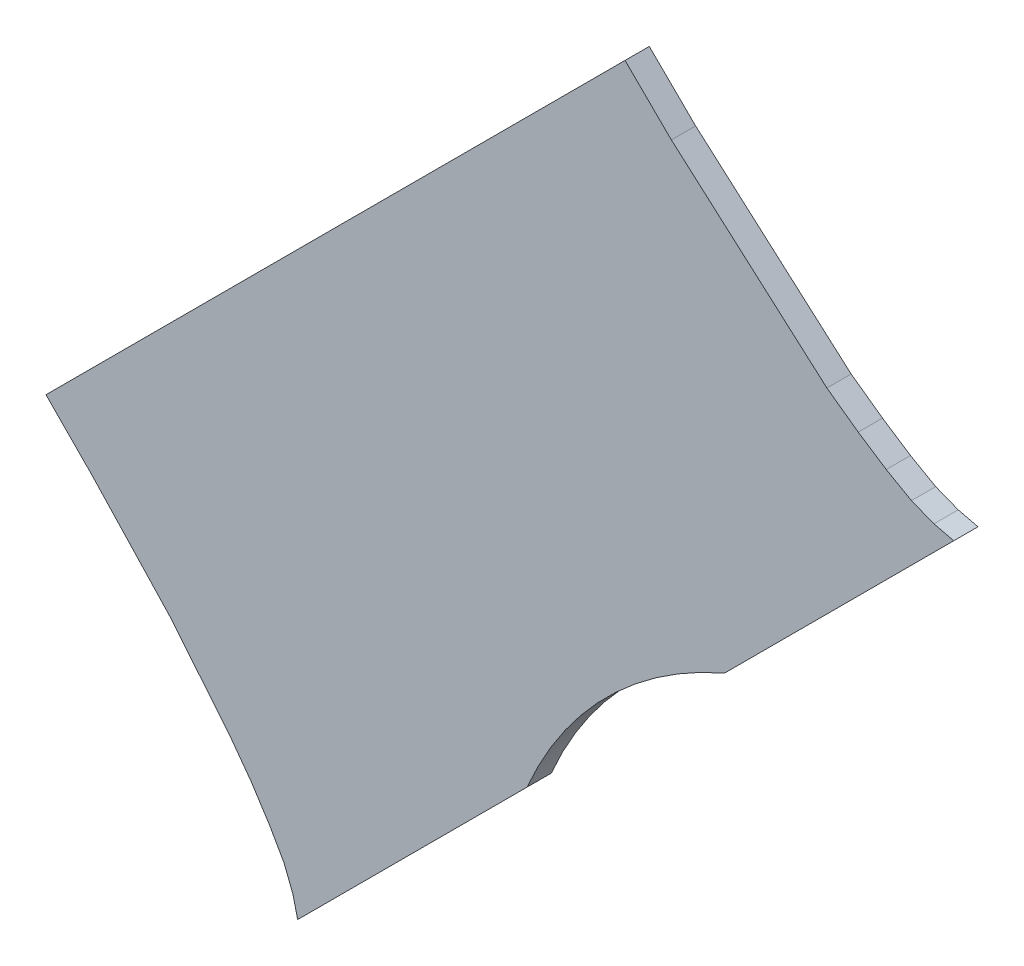
ISO-10303-21;
HEADER;
FILE_DESCRIPTION(('STEP AP214'),'2;1');
FILE_NAME('part.step','',(''),(''),'','','');
FILE_SCHEMA(('AUTOMOTIVE_DESIGN { 1 0 10303 214 1 1 1 1 }'));
ENDSEC;
DATA;
#1=APPLICATION_CONTEXT('core data for automotive mechanical design processes');
#2=APPLICATION_PROTOCOL_DEFINITION('international standard','automotive_design',2000,#1);
#3=PRODUCT_CONTEXT('',#1,'mechanical');
#4=PRODUCT('Part','Part','',(#3));
#5=PRODUCT_RELATED_PRODUCT_CATEGORY('part','',(#4));
#6=PRODUCT_DEFINITION_FORMATION('','',#4);
#7=PRODUCT_DEFINITION_CONTEXT('part definition',#1,'design');
#8=PRODUCT_DEFINITION('design','',#6,#7);
#9=PRODUCT_DEFINITION_SHAPE('','',#8);
#10=(LENGTH_UNIT() NAMED_UNIT(*) SI_UNIT(.MILLI.,.METRE.));
#11=(NAMED_UNIT(*) PLANE_ANGLE_UNIT() SI_UNIT($,.RADIAN.));
#12=(NAMED_UNIT(*) SI_UNIT($,.STERADIAN.) SOLID_ANGLE_UNIT());
#13=UNCERTAINTY_MEASURE_WITH_UNIT(LENGTH_MEASURE(1.E-05),#10,'distance_accuracy_value','');
#14=(GEOMETRIC_REPRESENTATION_CONTEXT(3) GLOBAL_UNCERTAINTY_ASSIGNED_CONTEXT((#13)) GLOBAL_UNIT_ASSIGNED_CONTEXT((#10,
#11,#12)) REPRESENTATION_CONTEXT('',''));
#15=CARTESIAN_POINT('',(0.,0.,0.));
#16=DIRECTION('',(0.,0.,1.));
#17=DIRECTION('',(1.,0.,0.));
#18=AXIS2_PLACEMENT_3D('',#15,#16,#17);
#19=CARTESIAN_POINT('',(78.5380020141602,71.7910003662109,0.));
#20=DIRECTION('',(0.707106781186548,-0.707106781186548,0.));
#21=DIRECTION('',(-0.707106781186548,-0.707106781186548,0.));
#22=AXIS2_PLACEMENT_3D('',#19,#20,#21);
#23=PLANE('',#22);
#24=DIRECTION('',(-0.707106781186548,-0.707106781186548,0.));
#25=VECTOR('',#24,1.);
#26=CARTESIAN_POINT('',(78.5380020141602,71.7910003662109,0.03556));
#27=LINE('',#26,#25);
#28=CARTESIAN_POINT('',(78.5380020141602,71.7910003662109,0.03556));
#29=VERTEX_POINT('',#28);
#30=CARTESIAN_POINT('',(77.6890029907227,70.9420013427734,0.03556));
#31=VERTEX_POINT('',#30);
#32=EDGE_CURVE('E11',#29,#31,#27,.T.);
#33=ORIENTED_EDGE('',*,*,#32,.F.);
#34=DIRECTION('',(0.,0.,1.));
#35=VECTOR('',#34,1.);
#36=CARTESIAN_POINT('',(78.5380020141602,71.7910003662109,0.));
#37=LINE('',#36,#35);
#38=CARTESIAN_POINT('',(78.5380020141602,71.7910003662109,0.));
#39=VERTEX_POINT('',#38);
#40=EDGE_CURVE('E24',#39,#29,#37,.T.);
#41=ORIENTED_EDGE('',*,*,#40,.F.);
#42=DIRECTION('',(-0.707106781186548,-0.707106781186548,0.));
#43=VECTOR('',#42,1.);
#44=CARTESIAN_POINT('',(78.5380020141602,71.7910003662109,0.));
#45=LINE('',#44,#43);
#46=CARTESIAN_POINT('',(77.6890029907227,70.9420013427734,0.));
#47=VERTEX_POINT('',#46);
#48=EDGE_CURVE('E297',#39,#47,#45,.T.);
#49=ORIENTED_EDGE('',*,*,#48,.T.);
#50=DIRECTION('',(0.,0.,1.));
#51=VECTOR('',#50,1.);
#52=CARTESIAN_POINT('',(77.6890029907227,70.9420013427734,0.));
#53=LINE('',#52,#51);
#54=EDGE_CURVE('E37',#47,#31,#53,.T.);
#55=ORIENTED_EDGE('',*,*,#54,.T.);
#56=EDGE_LOOP('',(#33,#41,#49,#55));
#57=FACE_BOUND('',#56,.T.);
#58=ADVANCED_FACE('F17',(#57),#23,.F.);
#59=CARTESIAN_POINT('',(78.6060028076172,71.7239990234375,0.));
#60=DIRECTION('',(-0.701852680042072,-0.712322129038373,0.));
#61=DIRECTION('',(-0.712322129038373,0.701852680042072,0.));
#62=AXIS2_PLACEMENT_3D('',#59,#60,#61);
#63=PLANE('',#62);
#64=DIRECTION('',(-0.712322129038373,0.701852680042072,0.));
#65=VECTOR('',#64,1.);
#66=CARTESIAN_POINT('',(78.6060028076172,71.7239990234375,0.03556));
#67=LINE('',#66,#65);
#68=CARTESIAN_POINT('',(78.6060028076172,71.7239990234375,0.03556));
#69=VERTEX_POINT('',#68);
#70=EDGE_CURVE('E293',#69,#29,#67,.T.);
#71=ORIENTED_EDGE('',*,*,#70,.F.);
#72=DIRECTION('',(0.,0.,1.));
#73=VECTOR('',#72,1.);
#74=CARTESIAN_POINT('',(78.6060028076172,71.7239990234375,0.));
#75=LINE('',#74,#73);
#76=CARTESIAN_POINT('',(78.6060028076172,71.7239990234375,0.));
#77=VERTEX_POINT('',#76);
#78=EDGE_CURVE('E291',#77,#69,#75,.T.);
#79=ORIENTED_EDGE('',*,*,#78,.F.);
#80=DIRECTION('',(-0.712322129038373,0.701852680042072,0.));
#81=VECTOR('',#80,1.);
#82=CARTESIAN_POINT('',(78.6060028076172,71.7239990234375,0.));
#83=LINE('',#82,#81);
#84=EDGE_CURVE('E289',#77,#39,#83,.T.);
#85=ORIENTED_EDGE('',*,*,#84,.T.);
#86=ORIENTED_EDGE('',*,*,#40,.T.);
#87=EDGE_LOOP('',(#71,#79,#85,#86));
#88=FACE_BOUND('',#87,.T.);
#89=ADVANCED_FACE('F300',(#88),#63,.F.);
#90=CARTESIAN_POINT('',(78.8339996337891,71.5230026245117,0.));
#91=DIRECTION('',(-0.661293645405142,-0.750127132256112,0.));
#92=DIRECTION('',(-0.750127132256112,0.661293645405142,0.));
#93=AXIS2_PLACEMENT_3D('',#90,#91,#92);
#94=PLANE('',#93);
#95=DIRECTION('',(-0.750127132256112,0.661293645405142,0.));
#96=VECTOR('',#95,1.);
#97=CARTESIAN_POINT('',(78.8339996337891,71.5230026245117,0.03556));
#98=LINE('',#97,#96);
#99=CARTESIAN_POINT('',(78.8339996337891,71.5230026245117,0.03556));
#100=VERTEX_POINT('',#99);
#101=EDGE_CURVE('E286',#100,#69,#98,.T.);
#102=ORIENTED_EDGE('',*,*,#101,.F.);
#103=DIRECTION('',(0.,0.,1.));
#104=VECTOR('',#103,1.);
#105=CARTESIAN_POINT('',(78.8339996337891,71.5230026245117,0.));
#106=LINE('',#105,#104);
#107=CARTESIAN_POINT('',(78.8339996337891,71.5230026245117,0.));
#108=VERTEX_POINT('',#107);
#109=EDGE_CURVE('E284',#108,#100,#106,.T.);
#110=ORIENTED_EDGE('',*,*,#109,.F.);
#111=DIRECTION('',(-0.750127132256112,0.661293645405142,0.));
#112=VECTOR('',#111,1.);
#113=CARTESIAN_POINT('',(78.8339996337891,71.5230026245117,0.));
#114=LINE('',#113,#112);
#115=EDGE_CURVE('E281',#108,#77,#114,.T.);
#116=ORIENTED_EDGE('',*,*,#115,.T.);
#117=ORIENTED_EDGE('',*,*,#78,.T.);
#118=EDGE_LOOP('',(#102,#110,#116,#117));
#119=FACE_BOUND('',#118,.T.);
#120=ADVANCED_FACE('F303',(#119),#94,.F.);
#121=CARTESIAN_POINT('',(78.879997253418,71.4899978637695,0.));
#122=DIRECTION('',(-0.582983306396356,-0.812484131822384,0.));
#123=DIRECTION('',(-0.812484131822384,0.582983306396356,0.));
#124=AXIS2_PLACEMENT_3D('',#121,#122,#123);
#125=PLANE('',#124);
#126=DIRECTION('',(-0.812484131822384,0.582983306396356,0.));
#127=VECTOR('',#126,1.);
#128=CARTESIAN_POINT('',(78.879997253418,71.4899978637695,0.03556));
#129=LINE('',#128,#127);
#130=CARTESIAN_POINT('',(78.879997253418,71.4899978637695,0.03556));
#131=VERTEX_POINT('',#130);
#132=EDGE_CURVE('E278',#131,#100,#129,.T.);
#133=ORIENTED_EDGE('',*,*,#132,.F.);
#134=DIRECTION('',(0.,0.,1.));
#135=VECTOR('',#134,1.);
#136=CARTESIAN_POINT('',(78.879997253418,71.4899978637695,0.));
#137=LINE('',#136,#135);
#138=CARTESIAN_POINT('',(78.879997253418,71.4899978637695,0.));
#139=VERTEX_POINT('',#138);
#140=EDGE_CURVE('E276',#139,#131,#137,.T.);
#141=ORIENTED_EDGE('',*,*,#140,.F.);
#142=DIRECTION('',(-0.812484131822384,0.582983306396356,0.));
#143=VECTOR('',#142,1.);
#144=CARTESIAN_POINT('',(78.879997253418,71.4899978637695,0.));
#145=LINE('',#144,#143);
#146=EDGE_CURVE('E273',#139,#108,#145,.T.);
#147=ORIENTED_EDGE('',*,*,#146,.T.);
#148=ORIENTED_EDGE('',*,*,#109,.T.);
#149=EDGE_LOOP('',(#133,#141,#147,#148));
#150=FACE_BOUND('',#149,.T.);
#151=ADVANCED_FACE('F308',(#150),#125,.F.);
#152=CARTESIAN_POINT('',(78.9209976196289,71.4629974365234,0.));
#153=DIRECTION('',(-0.549993213403991,-0.835169123716599,0.));
#154=DIRECTION('',(-0.835169123716599,0.549993213403991,0.));
#155=AXIS2_PLACEMENT_3D('',#152,#153,#154);
#156=PLANE('',#155);
#157=DIRECTION('',(-0.835169123716599,0.549993213403991,0.));
#158=VECTOR('',#157,1.);
#159=CARTESIAN_POINT('',(78.9209976196289,71.4629974365234,0.03556));
#160=LINE('',#159,#158);
#161=CARTESIAN_POINT('',(78.9209976196289,71.4629974365234,0.03556));
#162=VERTEX_POINT('',#161);
#163=EDGE_CURVE('E270',#162,#131,#160,.T.);
#164=ORIENTED_EDGE('',*,*,#163,.F.);
#165=DIRECTION('',(0.,0.,1.));
#166=VECTOR('',#165,1.);
#167=CARTESIAN_POINT('',(78.9209976196289,71.4629974365234,0.));
#168=LINE('',#167,#166);
#169=CARTESIAN_POINT('',(78.9209976196289,71.4629974365234,0.));
#170=VERTEX_POINT('',#169);
#171=EDGE_CURVE('E268',#170,#162,#168,.T.);
#172=ORIENTED_EDGE('',*,*,#171,.F.);
#173=DIRECTION('',(-0.835169123716599,0.549993213403991,0.));
#174=VECTOR('',#173,1.);
#175=CARTESIAN_POINT('',(78.9209976196289,71.4629974365234,0.));
#176=LINE('',#175,#174);
#177=EDGE_CURVE('E265',#170,#139,#176,.T.);
#178=ORIENTED_EDGE('',*,*,#177,.T.);
#179=ORIENTED_EDGE('',*,*,#140,.T.);
#180=EDGE_LOOP('',(#164,#172,#178,#179));
#181=FACE_BOUND('',#180,.T.);
#182=ADVANCED_FACE('F311',(#181),#156,.F.);
#183=CARTESIAN_POINT('',(78.9580001831055,71.4420013427734,0.));
#184=DIRECTION('',(-0.49351020523534,-0.869740005592805,0.));
#185=DIRECTION('',(-0.869740005592805,0.49351020523534,0.));
#186=AXIS2_PLACEMENT_3D('',#183,#184,#185);
#187=PLANE('',#186);
#188=DIRECTION('',(-0.869740005592805,0.49351020523534,0.));
#189=VECTOR('',#188,1.);
#190=CARTESIAN_POINT('',(78.9580001831055,71.4420013427734,0.03556));
#191=LINE('',#190,#189);
#192=CARTESIAN_POINT('',(78.9580001831055,71.4420013427734,0.03556));
#193=VERTEX_POINT('',#192);
#194=EDGE_CURVE('E262',#193,#162,#191,.T.);
#195=ORIENTED_EDGE('',*,*,#194,.F.);
#196=DIRECTION('',(0.,0.,1.));
#197=VECTOR('',#196,1.);
#198=CARTESIAN_POINT('',(78.9580001831055,71.4420013427734,0.));
#199=LINE('',#198,#197);
#200=CARTESIAN_POINT('',(78.9580001831055,71.4420013427734,0.));
#201=VERTEX_POINT('',#200);
#202=EDGE_CURVE('E260',#201,#193,#199,.T.);
#203=ORIENTED_EDGE('',*,*,#202,.F.);
#204=DIRECTION('',(-0.869740005592805,0.49351020523534,0.));
#205=VECTOR('',#204,1.);
#206=CARTESIAN_POINT('',(78.9580001831055,71.4420013427734,0.));
#207=LINE('',#206,#205);
#208=EDGE_CURVE('E257',#201,#170,#207,.T.);
#209=ORIENTED_EDGE('',*,*,#208,.T.);
#210=ORIENTED_EDGE('',*,*,#171,.T.);
#211=EDGE_LOOP('',(#195,#203,#209,#210));
#212=FACE_BOUND('',#211,.T.);
#213=ADVANCED_FACE('F316',(#212),#187,.F.);
#214=CARTESIAN_POINT('',(78.9909973144531,71.4290008544922,0.));
#215=DIRECTION('',(-0.366564019369772,-0.93039283085344,0.));
#216=DIRECTION('',(-0.93039283085344,0.366564019369772,0.));
#217=AXIS2_PLACEMENT_3D('',#214,#215,#216);
#218=PLANE('',#217);
#219=DIRECTION('',(-0.93039283085344,0.366564019369772,0.));
#220=VECTOR('',#219,1.);
#221=CARTESIAN_POINT('',(78.9909973144531,71.4290008544922,0.03556));
#222=LINE('',#221,#220);
#223=CARTESIAN_POINT('',(78.9909973144531,71.4290008544922,0.03556));
#224=VERTEX_POINT('',#223);
#225=EDGE_CURVE('E254',#224,#193,#222,.T.);
#226=ORIENTED_EDGE('',*,*,#225,.F.);
#227=DIRECTION('',(0.,0.,1.));
#228=VECTOR('',#227,1.);
#229=CARTESIAN_POINT('',(78.9909973144531,71.4290008544922,0.));
#230=LINE('',#229,#228);
#231=CARTESIAN_POINT('',(78.9909973144531,71.4290008544922,0.));
#232=VERTEX_POINT('',#231);
#233=EDGE_CURVE('E252',#232,#224,#230,.T.);
#234=ORIENTED_EDGE('',*,*,#233,.F.);
#235=DIRECTION('',(-0.93039283085344,0.366564019369772,0.));
#236=VECTOR('',#235,1.);
#237=CARTESIAN_POINT('',(78.9909973144531,71.4290008544922,0.));
#238=LINE('',#237,#236);
#239=EDGE_CURVE('E249',#232,#201,#238,.T.);
#240=ORIENTED_EDGE('',*,*,#239,.T.);
#241=ORIENTED_EDGE('',*,*,#202,.T.);
#242=EDGE_LOOP('',(#226,#234,#240,#241));
#243=FACE_BOUND('',#242,.T.);
#244=ADVANCED_FACE('F319',(#243),#218,.F.);
#245=CARTESIAN_POINT('',(79.0199966430664,71.4219970703125,0.));
#246=DIRECTION('',(-0.234765525660795,-0.972052029451722,0.));
#247=DIRECTION('',(-0.972052029451722,0.234765525660795,0.));
#248=AXIS2_PLACEMENT_3D('',#245,#246,#247);
#249=PLANE('',#248);
#250=DIRECTION('',(-0.972052029451722,0.234765525660795,0.));
#251=VECTOR('',#250,1.);
#252=CARTESIAN_POINT('',(79.0199966430664,71.4219970703125,0.03556));
#253=LINE('',#252,#251);
#254=CARTESIAN_POINT('',(79.0199966430664,71.4219970703125,0.03556));
#255=VERTEX_POINT('',#254);
#256=EDGE_CURVE('E246',#255,#224,#253,.T.);
#257=ORIENTED_EDGE('',*,*,#256,.F.);
#258=DIRECTION('',(0.,0.,1.));
#259=VECTOR('',#258,1.);
#260=CARTESIAN_POINT('',(79.0199966430664,71.4219970703125,0.));
#261=LINE('',#260,#259);
#262=CARTESIAN_POINT('',(79.0199966430664,71.4219970703125,0.));
#263=VERTEX_POINT('',#262);
#264=EDGE_CURVE('E244',#263,#255,#261,.T.);
#265=ORIENTED_EDGE('',*,*,#264,.F.);
#266=DIRECTION('',(-0.972052029451722,0.234765525660795,0.));
#267=VECTOR('',#266,1.);
#268=CARTESIAN_POINT('',(79.0199966430664,71.4219970703125,0.));
#269=LINE('',#268,#267);
#270=EDGE_CURVE('E241',#263,#232,#269,.T.);
#271=ORIENTED_EDGE('',*,*,#270,.T.);
#272=ORIENTED_EDGE('',*,*,#233,.T.);
#273=EDGE_LOOP('',(#257,#265,#271,#272));
#274=FACE_BOUND('',#273,.T.);
#275=ADVANCED_FACE('F324',(#274),#249,.F.);
#276=CARTESIAN_POINT('',(78.683732583027,71.0857330102731,0.));
#277=DIRECTION('',(-0.707106781186548,0.707106781186548,0.));
#278=DIRECTION('',(0.707106781186548,0.707106781186548,0.));
#279=AXIS2_PLACEMENT_3D('',#276,#277,#278);
#280=PLANE('',#279);
#281=DIRECTION('',(0.707106781186548,0.707106781186548,0.));
#282=VECTOR('',#281,1.);
#283=CARTESIAN_POINT('',(78.0579986572266,70.4599990844727,0.03556));
#284=LINE('',#283,#282);
#285=CARTESIAN_POINT('',(78.683732583027,71.0857330102731,0.03556));
#286=VERTEX_POINT('',#285);
#287=EDGE_CURVE('E238',#286,#255,#284,.T.);
#288=ORIENTED_EDGE('',*,*,#287,.F.);
#289=DIRECTION('',(0.,0.,1.));
#290=VECTOR('',#289,1.);
#291=CARTESIAN_POINT('',(78.683732583027,71.0857330102731,0.));
#292=LINE('',#291,#290);
#293=CARTESIAN_POINT('',(78.683732583027,71.0857330102731,0.));
#294=VERTEX_POINT('',#293);
#295=EDGE_CURVE('E236',#294,#286,#292,.T.);
#296=ORIENTED_EDGE('',*,*,#295,.F.);
#297=DIRECTION('',(0.707106781186548,0.707106781186548,0.));
#298=VECTOR('',#297,1.);
#299=CARTESIAN_POINT('',(78.0579986572266,70.4599990844727,0.));
#300=LINE('',#299,#298);
#301=EDGE_CURVE('E233',#294,#263,#300,.T.);
#302=ORIENTED_EDGE('',*,*,#301,.T.);
#303=ORIENTED_EDGE('',*,*,#264,.T.);
#304=EDGE_LOOP('',(#288,#296,#302,#303));
#305=FACE_BOUND('',#304,.T.);
#306=ADVANCED_FACE('F327',(#305),#280,.F.);
#307=CARTESIAN_POINT('',(78.90002,70.5800468,0.));
#308=DIRECTION('',(0.,0.,-1.));
#309=DIRECTION('',(1.,0.,0.));
#310=AXIS2_PLACEMENT_3D('',#307,#308,#309);
#311=CYLINDRICAL_SURFACE('',#310,0.5499989);
#312=ORIENTED_EDGE('',*,*,#295,.T.);
#313=CARTESIAN_POINT('',(78.90002,70.5800468,0.03556));
#314=DIRECTION('',(0.,0.,1.));
#315=DIRECTION('',(1.,0.,0.));
#316=AXIS2_PLACEMENT_3D('',#313,#314,#315);
#317=CIRCLE('',#316,0.5499989);
#318=CARTESIAN_POINT('',(78.3943337897269,70.796334216973,0.03556));
#319=VERTEX_POINT('',#318);
#320=EDGE_CURVE('E230',#286,#319,#317,.T.);
#321=ORIENTED_EDGE('',*,*,#320,.T.);
#322=DIRECTION('',(0.,0.,1.));
#323=VECTOR('',#322,1.);
#324=CARTESIAN_POINT('',(78.3943337897269,70.796334216973,0.));
#325=LINE('',#324,#323);
#326=CARTESIAN_POINT('',(78.3943337897269,70.796334216973,0.));
#327=VERTEX_POINT('',#326);
#328=EDGE_CURVE('E228',#327,#319,#325,.T.);
#329=ORIENTED_EDGE('',*,*,#328,.F.);
#330=CARTESIAN_POINT('',(78.90002,70.5800468,0.));
#331=DIRECTION('',(0.,0.,1.));
#332=DIRECTION('',(1.,0.,0.));
#333=AXIS2_PLACEMENT_3D('',#330,#331,#332);
#334=CIRCLE('',#333,0.5499989);
#335=EDGE_CURVE('E225',#294,#327,#334,.T.);
#336=ORIENTED_EDGE('',*,*,#335,.F.);
#337=EDGE_LOOP('',(#312,#321,#329,#336));
#338=FACE_BOUND('',#337,.T.);
#339=ADVANCED_FACE('F333',(#338),#311,.F.);
#340=CARTESIAN_POINT('',(78.0579986572266,70.4599990844727,0.));
#341=DIRECTION('',(-0.707106781186548,0.707106781186548,0.));
#342=DIRECTION('',(0.707106781186548,0.707106781186548,0.));
#343=AXIS2_PLACEMENT_3D('',#340,#341,#342);
#344=PLANE('',#343);
#345=DIRECTION('',(0.707106781186548,0.707106781186548,0.));
#346=VECTOR('',#345,1.);
#347=CARTESIAN_POINT('',(78.0579986572266,70.4599990844727,0.03556));
#348=LINE('',#347,#346);
#349=CARTESIAN_POINT('',(78.0579986572266,70.4599990844727,0.03556));
#350=VERTEX_POINT('',#349);
#351=EDGE_CURVE('E222',#350,#319,#348,.T.);
#352=ORIENTED_EDGE('',*,*,#351,.F.);
#353=DIRECTION('',(0.,0.,1.));
#354=VECTOR('',#353,1.);
#355=CARTESIAN_POINT('',(78.0579986572266,70.4599990844727,0.));
#356=LINE('',#355,#354);
#357=CARTESIAN_POINT('',(78.0579986572266,70.4599990844727,0.));
#358=VERTEX_POINT('',#357);
#359=EDGE_CURVE('E220',#358,#350,#356,.T.);
#360=ORIENTED_EDGE('',*,*,#359,.F.);
#361=EDGE_CURVE('E219',#358,#327,#300,.T.);
#362=ORIENTED_EDGE('',*,*,#361,.T.);
#363=ORIENTED_EDGE('',*,*,#328,.T.);
#364=EDGE_LOOP('',(#352,#360,#362,#363));
#365=FACE_BOUND('',#364,.T.);
#366=ADVANCED_FACE('F336',(#365),#344,.F.);
#367=CARTESIAN_POINT('',(78.0510025024414,70.4889984130859,0.));
#368=DIRECTION('',(0.972110362941644,0.234523862882791,0.));
#369=DIRECTION('',(0.234523862882791,-0.972110362941644,0.));
#370=AXIS2_PLACEMENT_3D('',#367,#368,#369);
#371=PLANE('',#370);
#372=DIRECTION('',(0.234523862882791,-0.972110362941644,0.));
#373=VECTOR('',#372,1.);
#374=CARTESIAN_POINT('',(78.0510025024414,70.4889984130859,0.03556));
#375=LINE('',#374,#373);
#376=CARTESIAN_POINT('',(78.0510025024414,70.4889984130859,0.03556));
#377=VERTEX_POINT('',#376);
#378=EDGE_CURVE('E216',#377,#350,#375,.T.);
#379=ORIENTED_EDGE('',*,*,#378,.F.);
#380=DIRECTION('',(0.,0.,1.));
#381=VECTOR('',#380,1.);
#382=CARTESIAN_POINT('',(78.0510025024414,70.4889984130859,0.));
#383=LINE('',#382,#381);
#384=CARTESIAN_POINT('',(78.0510025024414,70.4889984130859,0.));
#385=VERTEX_POINT('',#384);
#386=EDGE_CURVE('E214',#385,#377,#383,.T.);
#387=ORIENTED_EDGE('',*,*,#386,.F.);
#388=DIRECTION('',(0.234523862882791,-0.972110362941644,0.));
#389=VECTOR('',#388,1.);
#390=CARTESIAN_POINT('',(78.0510025024414,70.4889984130859,0.));
#391=LINE('',#390,#389);
#392=EDGE_CURVE('E211',#385,#358,#391,.T.);
#393=ORIENTED_EDGE('',*,*,#392,.T.);
#394=ORIENTED_EDGE('',*,*,#359,.T.);
#395=EDGE_LOOP('',(#379,#387,#393,#394));
#396=FACE_BOUND('',#395,.T.);
#397=ADVANCED_FACE('F341',(#396),#371,.F.);
#398=CARTESIAN_POINT('',(78.0380020141601,70.5220031738281,0.));
#399=DIRECTION('',(0.930421727639445,0.366490666642999,0.));
#400=DIRECTION('',(0.366490666642999,-0.930421727639445,0.));
#401=AXIS2_PLACEMENT_3D('',#398,#399,#400);
#402=PLANE('',#401);
#403=DIRECTION('',(0.366490666642999,-0.930421727639445,0.));
#404=VECTOR('',#403,1.);
#405=CARTESIAN_POINT('',(78.0380020141601,70.5220031738281,0.03556));
#406=LINE('',#405,#404);
#407=CARTESIAN_POINT('',(78.0380020141601,70.5220031738281,0.03556));
#408=VERTEX_POINT('',#407);
#409=EDGE_CURVE('E208',#408,#377,#406,.T.);
#410=ORIENTED_EDGE('',*,*,#409,.F.);
#411=DIRECTION('',(0.,0.,1.));
#412=VECTOR('',#411,1.);
#413=CARTESIAN_POINT('',(78.0380020141601,70.5220031738281,0.));
#414=LINE('',#413,#412);
#415=CARTESIAN_POINT('',(78.0380020141601,70.5220031738281,0.));
#416=VERTEX_POINT('',#415);
#417=EDGE_CURVE('E206',#416,#408,#414,.T.);
#418=ORIENTED_EDGE('',*,*,#417,.F.);
#419=DIRECTION('',(0.366490666642999,-0.930421727639445,0.));
#420=VECTOR('',#419,1.);
#421=CARTESIAN_POINT('',(78.0380020141601,70.5220031738281,0.));
#422=LINE('',#421,#420);
#423=EDGE_CURVE('E203',#416,#385,#422,.T.);
#424=ORIENTED_EDGE('',*,*,#423,.T.);
#425=ORIENTED_EDGE('',*,*,#386,.T.);
#426=EDGE_LOOP('',(#410,#418,#424,#425));
#427=FACE_BOUND('',#426,.T.);
#428=ADVANCED_FACE('F344',(#427),#402,.F.);
#429=CARTESIAN_POINT('',(78.0169982910156,70.5589981079102,0.));
#430=DIRECTION('',(0.869619323658949,0.493722829043738,0.));
#431=DIRECTION('',(0.493722829043738,-0.869619323658949,0.));
#432=AXIS2_PLACEMENT_3D('',#429,#430,#431);
#433=PLANE('',#432);
#434=DIRECTION('',(0.493722829043738,-0.869619323658949,0.));
#435=VECTOR('',#434,1.);
#436=CARTESIAN_POINT('',(78.0169982910156,70.5589981079102,0.03556));
#437=LINE('',#436,#435);
#438=CARTESIAN_POINT('',(78.0169982910156,70.5589981079102,0.03556));
#439=VERTEX_POINT('',#438);
#440=EDGE_CURVE('E200',#439,#408,#437,.T.);
#441=ORIENTED_EDGE('',*,*,#440,.F.);
#442=DIRECTION('',(0.,0.,1.));
#443=VECTOR('',#442,1.);
#444=CARTESIAN_POINT('',(78.0169982910156,70.5589981079102,0.));
#445=LINE('',#444,#443);
#446=CARTESIAN_POINT('',(78.0169982910156,70.5589981079102,0.));
#447=VERTEX_POINT('',#446);
#448=EDGE_CURVE('E198',#447,#439,#445,.T.);
#449=ORIENTED_EDGE('',*,*,#448,.F.);
#450=DIRECTION('',(0.493722829043738,-0.869619323658949,0.));
#451=VECTOR('',#450,1.);
#452=CARTESIAN_POINT('',(78.0169982910156,70.5589981079102,0.));
#453=LINE('',#452,#451);
#454=EDGE_CURVE('E195',#447,#416,#453,.T.);
#455=ORIENTED_EDGE('',*,*,#454,.T.);
#456=ORIENTED_EDGE('',*,*,#417,.T.);
#457=EDGE_LOOP('',(#441,#449,#455,#456));
#458=FACE_BOUND('',#457,.T.);
#459=ADVANCED_FACE('F349',(#458),#433,.F.);
#460=CARTESIAN_POINT('',(77.9899978637695,70.6009979248047,0.));
#461=DIRECTION('',(0.841173510664031,0.540765314121708,0.));
#462=DIRECTION('',(0.540765314121708,-0.841173510664031,0.));
#463=AXIS2_PLACEMENT_3D('',#460,#461,#462);
#464=PLANE('',#463);
#465=DIRECTION('',(0.540765314121708,-0.841173510664031,0.));
#466=VECTOR('',#465,1.);
#467=CARTESIAN_POINT('',(77.9899978637695,70.6009979248047,0.03556));
#468=LINE('',#467,#466);
#469=CARTESIAN_POINT('',(77.9899978637695,70.6009979248047,0.03556));
#470=VERTEX_POINT('',#469);
#471=EDGE_CURVE('E192',#470,#439,#468,.T.);
#472=ORIENTED_EDGE('',*,*,#471,.F.);
#473=DIRECTION('',(0.,0.,1.));
#474=VECTOR('',#473,1.);
#475=CARTESIAN_POINT('',(77.9899978637695,70.6009979248047,0.));
#476=LINE('',#475,#474);
#477=CARTESIAN_POINT('',(77.9899978637695,70.6009979248047,0.));
#478=VERTEX_POINT('',#477);
#479=EDGE_CURVE('E190',#478,#470,#476,.T.);
#480=ORIENTED_EDGE('',*,*,#479,.F.);
#481=DIRECTION('',(0.540765314121708,-0.841173510664031,0.));
#482=VECTOR('',#481,1.);
#483=CARTESIAN_POINT('',(77.9899978637695,70.6009979248047,0.));
#484=LINE('',#483,#482);
#485=EDGE_CURVE('E187',#478,#447,#484,.T.);
#486=ORIENTED_EDGE('',*,*,#485,.T.);
#487=ORIENTED_EDGE('',*,*,#448,.T.);
#488=EDGE_LOOP('',(#472,#480,#486,#487));
#489=FACE_BOUND('',#488,.T.);
#490=ADVANCED_FACE('F352',(#489),#464,.F.);
#491=CARTESIAN_POINT('',(77.9570007324219,70.6460037231445,0.));
#492=DIRECTION('',(0.806465840412646,0.591280684825342,0.));
#493=DIRECTION('',(0.591280684825342,-0.806465840412646,0.));
#494=AXIS2_PLACEMENT_3D('',#491,#492,#493);
#495=PLANE('',#494);
#496=DIRECTION('',(0.591280684825342,-0.806465840412646,0.));
#497=VECTOR('',#496,1.);
#498=CARTESIAN_POINT('',(77.9570007324219,70.6460037231445,0.03556));
#499=LINE('',#498,#497);
#500=CARTESIAN_POINT('',(77.9570007324219,70.6460037231445,0.03556));
#501=VERTEX_POINT('',#500);
#502=EDGE_CURVE('E184',#501,#470,#499,.T.);
#503=ORIENTED_EDGE('',*,*,#502,.F.);
#504=DIRECTION('',(0.,0.,1.));
#505=VECTOR('',#504,1.);
#506=CARTESIAN_POINT('',(77.9570007324219,70.6460037231445,0.));
#507=LINE('',#506,#505);
#508=CARTESIAN_POINT('',(77.9570007324219,70.6460037231445,0.));
#509=VERTEX_POINT('',#508);
#510=EDGE_CURVE('E182',#509,#501,#507,.T.);
#511=ORIENTED_EDGE('',*,*,#510,.F.);
#512=DIRECTION('',(0.591280684825342,-0.806465840412646,0.));
#513=VECTOR('',#512,1.);
#514=CARTESIAN_POINT('',(77.9570007324219,70.6460037231445,0.));
#515=LINE('',#514,#513);
#516=EDGE_CURVE('E179',#509,#478,#515,.T.);
#517=ORIENTED_EDGE('',*,*,#516,.T.);
#518=ORIENTED_EDGE('',*,*,#479,.T.);
#519=EDGE_LOOP('',(#503,#511,#517,#518));
#520=FACE_BOUND('',#519,.T.);
#521=ADVANCED_FACE('F355',(#520),#495,.F.);
#522=CARTESIAN_POINT('',(77.870002746582,70.7519989013672,0.));
#523=DIRECTION('',(0.772974721704022,0.634436820815588,0.));
#524=DIRECTION('',(0.634436820815588,-0.772974721704022,0.));
#525=AXIS2_PLACEMENT_3D('',#522,#523,#524);
#526=PLANE('',#525);
#527=DIRECTION('',(0.634436820815588,-0.772974721704022,0.));
#528=VECTOR('',#527,1.);
#529=CARTESIAN_POINT('',(77.870002746582,70.7519989013672,0.03556));
#530=LINE('',#529,#528);
#531=CARTESIAN_POINT('',(77.870002746582,70.7519989013672,0.03556));
#532=VERTEX_POINT('',#531);
#533=EDGE_CURVE('E176',#532,#501,#530,.T.);
#534=ORIENTED_EDGE('',*,*,#533,.F.);
#535=DIRECTION('',(0.,0.,1.));
#536=VECTOR('',#535,1.);
#537=CARTESIAN_POINT('',(77.870002746582,70.7519989013672,0.));
#538=LINE('',#537,#536);
#539=CARTESIAN_POINT('',(77.870002746582,70.7519989013672,0.));
#540=VERTEX_POINT('',#539);
#541=EDGE_CURVE('E174',#540,#532,#538,.T.);
#542=ORIENTED_EDGE('',*,*,#541,.F.);
#543=DIRECTION('',(0.634436820815588,-0.772974721704022,0.));
#544=VECTOR('',#543,1.);
#545=CARTESIAN_POINT('',(77.870002746582,70.7519989013672,0.));
#546=LINE('',#545,#544);
#547=EDGE_CURVE('E165',#540,#509,#546,.T.);
#548=ORIENTED_EDGE('',*,*,#547,.T.);
#549=ORIENTED_EDGE('',*,*,#510,.T.);
#550=EDGE_LOOP('',(#534,#542,#548,#549));
#551=FACE_BOUND('',#550,.T.);
#552=ADVANCED_FACE('F358',(#551),#526,.F.);
#553=CARTESIAN_POINT('',(77.7559967041016,70.8740005493164,0.));
#554=DIRECTION('',(0.730643374269308,0.682759298462027,0.));
#555=DIRECTION('',(0.682759298462027,-0.730643374269308,0.));
#556=AXIS2_PLACEMENT_3D('',#553,#554,#555);
#557=PLANE('',#556);
#558=DIRECTION('',(0.682759298462027,-0.730643374269308,0.));
#559=VECTOR('',#558,1.);
#560=CARTESIAN_POINT('',(77.7559967041016,70.8740005493164,0.03556));
#561=LINE('',#560,#559);
#562=CARTESIAN_POINT('',(77.7559967041016,70.8740005493164,0.03556));
#563=VERTEX_POINT('',#562);
#564=EDGE_CURVE('E151',#563,#532,#561,.T.);
#565=ORIENTED_EDGE('',*,*,#564,.F.);
#566=DIRECTION('',(0.,0.,1.));
#567=VECTOR('',#566,1.);
#568=CARTESIAN_POINT('',(77.7559967041016,70.8740005493164,0.));
#569=LINE('',#568,#567);
#570=CARTESIAN_POINT('',(77.7559967041016,70.8740005493164,0.));
#571=VERTEX_POINT('',#570);
#572=EDGE_CURVE('E146',#571,#563,#569,.T.);
#573=ORIENTED_EDGE('',*,*,#572,.F.);
#574=DIRECTION('',(0.682759298462027,-0.730643374269308,0.));
#575=VECTOR('',#574,1.);
#576=CARTESIAN_POINT('',(77.7559967041016,70.8740005493164,0.));
#577=LINE('',#576,#575);
#578=EDGE_CURVE('E149',#571,#540,#577,.T.);
#579=ORIENTED_EDGE('',*,*,#578,.T.);
#580=ORIENTED_EDGE('',*,*,#541,.T.);
#581=EDGE_LOOP('',(#565,#573,#579,#580));
#582=FACE_BOUND('',#581,.T.);
#583=ADVANCED_FACE('F148',(#582),#557,.F.);
#584=CARTESIAN_POINT('',(77.6890029907227,70.9420013427734,0.));
#585=DIRECTION('',(0.712362085474239,0.701812125271995,0.));
#586=DIRECTION('',(0.701812125271995,-0.712362085474239,0.));
#587=AXIS2_PLACEMENT_3D('',#584,#585,#586);
#588=PLANE('',#587);
#589=DIRECTION('',(0.701812125271995,-0.712362085474239,0.));
#590=VECTOR('',#589,1.);
#591=CARTESIAN_POINT('',(77.6890029907227,70.9420013427734,0.03556));
#592=LINE('',#591,#590);
#593=EDGE_CURVE('E166',#31,#563,#592,.T.);
#594=ORIENTED_EDGE('',*,*,#593,.F.);
#595=ORIENTED_EDGE('',*,*,#54,.F.);
#596=DIRECTION('',(0.701812125271995,-0.712362085474239,0.));
#597=VECTOR('',#596,1.);
#598=CARTESIAN_POINT('',(77.6890029907227,70.9420013427734,0.));
#599=LINE('',#598,#597);
#600=EDGE_CURVE('E162',#47,#571,#599,.T.);
#601=ORIENTED_EDGE('',*,*,#600,.T.);
#602=ORIENTED_EDGE('',*,*,#572,.T.);
#603=EDGE_LOOP('',(#594,#595,#601,#602));
#604=FACE_BOUND('',#603,.T.);
#605=ADVANCED_FACE('F168',(#604),#588,.F.);
#606=CARTESIAN_POINT('',(77.6890029907227,70.9420013427734,0.));
#607=DIRECTION('',(0.,0.,1.));
#608=DIRECTION('',(1.,0.,0.));
#609=AXIS2_PLACEMENT_3D('',#606,#607,#608);
#610=PLANE('',#609);
#611=ORIENTED_EDGE('',*,*,#600,.F.);
#612=ORIENTED_EDGE('',*,*,#48,.F.);
#613=ORIENTED_EDGE('',*,*,#84,.F.);
#614=ORIENTED_EDGE('',*,*,#115,.F.);
#615=ORIENTED_EDGE('',*,*,#146,.F.);
#616=ORIENTED_EDGE('',*,*,#177,.F.);
#617=ORIENTED_EDGE('',*,*,#208,.F.);
#618=ORIENTED_EDGE('',*,*,#239,.F.);
#619=ORIENTED_EDGE('',*,*,#270,.F.);
#620=ORIENTED_EDGE('',*,*,#301,.F.);
#621=ORIENTED_EDGE('',*,*,#335,.T.);
#622=ORIENTED_EDGE('',*,*,#361,.F.);
#623=ORIENTED_EDGE('',*,*,#392,.F.);
#624=ORIENTED_EDGE('',*,*,#423,.F.);
#625=ORIENTED_EDGE('',*,*,#454,.F.);
#626=ORIENTED_EDGE('',*,*,#485,.F.);
#627=ORIENTED_EDGE('',*,*,#516,.F.);
#628=ORIENTED_EDGE('',*,*,#547,.F.);
#629=ORIENTED_EDGE('',*,*,#578,.F.);
#630=EDGE_LOOP('',(#611,#612,#613,#614,#615,#616,#617,#618,#619,#620,#621,#622,#623,#624,#625,
#626,#627,#628,#629));
#631=FACE_BOUND('',#630,.T.);
#632=ADVANCED_FACE('F160',(#631),#610,.F.);
#633=CARTESIAN_POINT('',(77.6890029907227,70.9420013427734,0.03556));
#634=DIRECTION('',(0.,0.,1.));
#635=DIRECTION('',(1.,0.,0.));
#636=AXIS2_PLACEMENT_3D('',#633,#634,#635);
#637=PLANE('',#636);
#638=ORIENTED_EDGE('',*,*,#32,.T.);
#639=ORIENTED_EDGE('',*,*,#593,.T.);
#640=ORIENTED_EDGE('',*,*,#564,.T.);
#641=ORIENTED_EDGE('',*,*,#533,.T.);
#642=ORIENTED_EDGE('',*,*,#502,.T.);
#643=ORIENTED_EDGE('',*,*,#471,.T.);
#644=ORIENTED_EDGE('',*,*,#440,.T.);
#645=ORIENTED_EDGE('',*,*,#409,.T.);
#646=ORIENTED_EDGE('',*,*,#378,.T.);
#647=ORIENTED_EDGE('',*,*,#351,.T.);
#648=ORIENTED_EDGE('',*,*,#320,.F.);
#649=ORIENTED_EDGE('',*,*,#287,.T.);
#650=ORIENTED_EDGE('',*,*,#256,.T.);
#651=ORIENTED_EDGE('',*,*,#225,.T.);
#652=ORIENTED_EDGE('',*,*,#194,.T.);
#653=ORIENTED_EDGE('',*,*,#163,.T.);
#654=ORIENTED_EDGE('',*,*,#132,.T.);
#655=ORIENTED_EDGE('',*,*,#101,.T.);
#656=ORIENTED_EDGE('',*,*,#70,.T.);
#657=EDGE_LOOP('',(#638,#639,#640,#641,#642,#643,#644,#645,#646,#647,#648,#649,#650,#651,#652,
#653,#654,#655,#656));
#658=FACE_BOUND('',#657,.T.);
#659=ADVANCED_FACE('F360',(#658),#637,.T.);
#660=CLOSED_SHELL('',(#58,#89,#120,#151,#182,#213,#244,#275,#306,#339,#366,#397,#428,#459,#490,
#521,#552,#583,#605,#632,#659));
#661=MANIFOLD_SOLID_BREP('B1',#660);
#662=ADVANCED_BREP_SHAPE_REPRESENTATION('',(#18,#661),#14);
#663=SHAPE_DEFINITION_REPRESENTATION(#9,#662);
ENDSEC;
END-ISO-10303-21;
